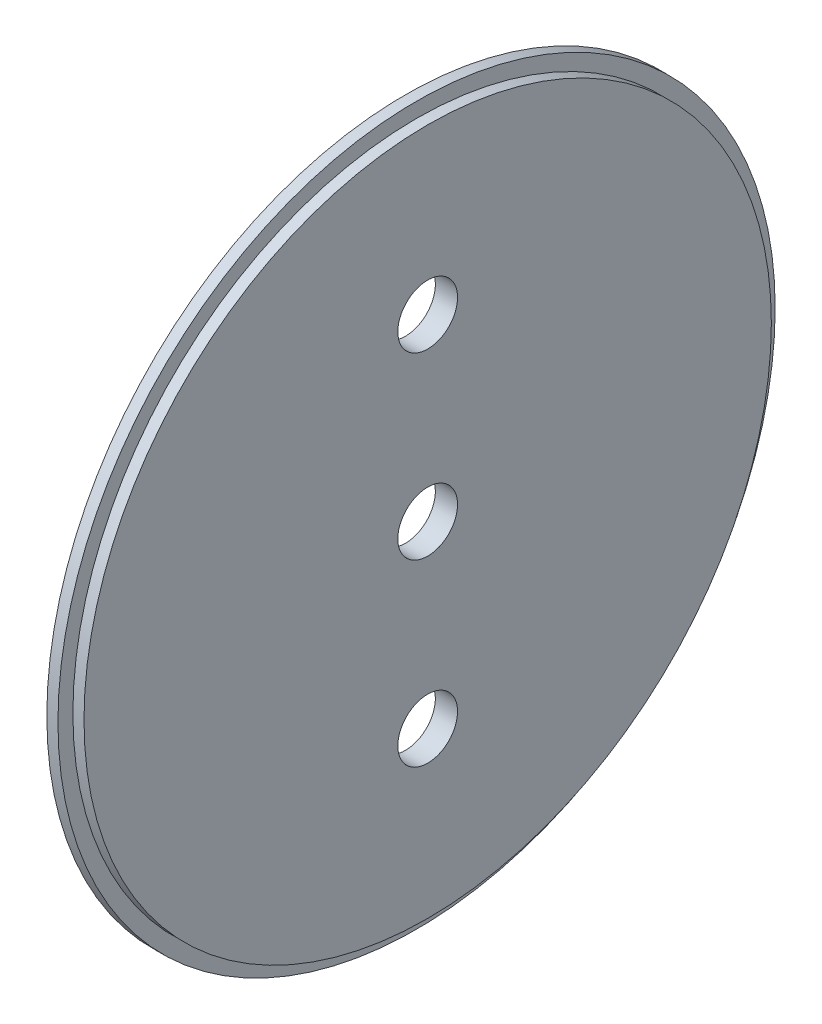
ISO-10303-21;
HEADER;
FILE_DESCRIPTION(('STEP AP214'),'2;1');
FILE_NAME('part.step','',(''),(''),'','','');
FILE_SCHEMA(('AUTOMOTIVE_DESIGN { 1 0 10303 214 1 1 1 1 }'));
ENDSEC;
DATA;
#1=APPLICATION_CONTEXT('core data for automotive mechanical design processes');
#2=APPLICATION_PROTOCOL_DEFINITION('international standard','automotive_design',2000,#1);
#3=PRODUCT_CONTEXT('',#1,'mechanical');
#4=PRODUCT('Part','Part','',(#3));
#5=PRODUCT_RELATED_PRODUCT_CATEGORY('part','',(#4));
#6=PRODUCT_DEFINITION_FORMATION('','',#4);
#7=PRODUCT_DEFINITION_CONTEXT('part definition',#1,'design');
#8=PRODUCT_DEFINITION('design','',#6,#7);
#9=PRODUCT_DEFINITION_SHAPE('','',#8);
#10=(LENGTH_UNIT() NAMED_UNIT(*) SI_UNIT(.MILLI.,.METRE.));
#11=(NAMED_UNIT(*) PLANE_ANGLE_UNIT() SI_UNIT($,.RADIAN.));
#12=(NAMED_UNIT(*) SI_UNIT($,.STERADIAN.) SOLID_ANGLE_UNIT());
#13=UNCERTAINTY_MEASURE_WITH_UNIT(LENGTH_MEASURE(1.E-05),#10,'distance_accuracy_value','');
#14=(GEOMETRIC_REPRESENTATION_CONTEXT(3) GLOBAL_UNCERTAINTY_ASSIGNED_CONTEXT((#13)) GLOBAL_UNIT_ASSIGNED_CONTEXT((#10,
#11,#12)) REPRESENTATION_CONTEXT('',''));
#15=CARTESIAN_POINT('',(0.,0.,0.));
#16=DIRECTION('',(0.,0.,1.));
#17=DIRECTION('',(1.,0.,0.));
#18=AXIS2_PLACEMENT_3D('',#15,#16,#17);
#19=CARTESIAN_POINT('',(1.1811,0.,0.));
#20=DIRECTION('',(-1.,0.,0.));
#21=DIRECTION('',(0.,0.,1.));
#22=AXIS2_PLACEMENT_3D('',#19,#20,#21);
#23=CYLINDRICAL_SURFACE('',#22,38.1);
#24=CARTESIAN_POINT('',(1.1811,0.,0.));
#25=DIRECTION('',(1.,0.,0.));
#26=DIRECTION('',(0.,0.,-1.));
#27=AXIS2_PLACEMENT_3D('',#24,#25,#26);
#28=CIRCLE('',#27,38.1);
#29=CARTESIAN_POINT('',(1.1811,0.,-38.1));
#30=VERTEX_POINT('',#29);
#31=EDGE_CURVE('E51',#30,#30,#28,.T.);
#32=ORIENTED_EDGE('',*,*,#31,.F.);
#33=EDGE_LOOP('',(#32));
#34=FACE_BOUND('',#33,.T.);
#35=CARTESIAN_POINT('',(0.,0.,0.));
#36=DIRECTION('',(1.,0.,0.));
#37=DIRECTION('',(0.,0.,-1.));
#38=AXIS2_PLACEMENT_3D('',#35,#36,#37);
#39=CIRCLE('',#38,38.1);
#40=CARTESIAN_POINT('',(0.,0.,-38.1));
#41=VERTEX_POINT('',#40);
#42=EDGE_CURVE('E46',#41,#41,#39,.T.);
#43=ORIENTED_EDGE('',*,*,#42,.T.);
#44=EDGE_LOOP('',(#43));
#45=FACE_BOUND('',#44,.T.);
#46=ADVANCED_FACE('F43',(#34,#45),#23,.T.);
#47=CARTESIAN_POINT('',(1.1811,0.,0.));
#48=DIRECTION('',(1.,0.,0.));
#49=DIRECTION('',(0.,0.,-1.));
#50=AXIS2_PLACEMENT_3D('',#47,#48,#49);
#51=PLANE('',#50);
#52=CARTESIAN_POINT('',(1.1811,0.,0.));
#53=DIRECTION('',(1.,0.,0.));
#54=DIRECTION('',(0.,0.,-1.));
#55=AXIS2_PLACEMENT_3D('',#52,#53,#54);
#56=CIRCLE('',#55,36.5125);
#57=CARTESIAN_POINT('',(1.1811,0.,-36.5125));
#58=VERTEX_POINT('',#57);
#59=EDGE_CURVE('E10',#58,#58,#56,.T.);
#60=ORIENTED_EDGE('',*,*,#59,.F.);
#61=EDGE_LOOP('',(#60));
#62=FACE_BOUND('',#61,.T.);
#63=ORIENTED_EDGE('',*,*,#31,.T.);
#64=EDGE_LOOP('',(#63));
#65=FACE_BOUND('',#64,.T.);
#66=ADVANCED_FACE('F93',(#62,#65),#51,.T.);
#67=CARTESIAN_POINT('',(0.,0.,0.));
#68=DIRECTION('',(1.,0.,0.));
#69=DIRECTION('',(0.,0.,-1.));
#70=AXIS2_PLACEMENT_3D('',#67,#68,#69);
#71=PLANE('',#70);
#72=CARTESIAN_POINT('',(0.,19.05,0.));
#73=DIRECTION('',(-1.,0.,0.));
#74=DIRECTION('',(0.,0.,1.));
#75=AXIS2_PLACEMENT_3D('',#72,#73,#74);
#76=CIRCLE('',#75,3.17500000000001);
#77=CARTESIAN_POINT('',(0.,19.05,3.17500000000001));
#78=VERTEX_POINT('',#77);
#79=EDGE_CURVE('E75',#78,#78,#76,.T.);
#80=ORIENTED_EDGE('',*,*,#79,.F.);
#81=EDGE_LOOP('',(#80));
#82=FACE_BOUND('',#81,.T.);
#83=CARTESIAN_POINT('',(0.,-19.05,0.));
#84=DIRECTION('',(-1.,0.,0.));
#85=DIRECTION('',(0.,0.,1.));
#86=AXIS2_PLACEMENT_3D('',#83,#84,#85);
#87=CIRCLE('',#86,3.175);
#88=CARTESIAN_POINT('',(0.,-19.05,3.175));
#89=VERTEX_POINT('',#88);
#90=EDGE_CURVE('E67',#89,#89,#87,.T.);
#91=ORIENTED_EDGE('',*,*,#90,.F.);
#92=EDGE_LOOP('',(#91));
#93=FACE_BOUND('',#92,.T.);
#94=CARTESIAN_POINT('',(0.,0.,0.));
#95=DIRECTION('',(-1.,0.,0.));
#96=DIRECTION('',(0.,0.,1.));
#97=AXIS2_PLACEMENT_3D('',#94,#95,#96);
#98=CIRCLE('',#97,3.175);
#99=CARTESIAN_POINT('',(0.,0.,3.175));
#100=VERTEX_POINT('',#99);
#101=EDGE_CURVE('E63',#100,#100,#98,.T.);
#102=ORIENTED_EDGE('',*,*,#101,.F.);
#103=EDGE_LOOP('',(#102));
#104=FACE_BOUND('',#103,.T.);
#105=ORIENTED_EDGE('',*,*,#42,.F.);
#106=EDGE_LOOP('',(#105));
#107=FACE_BOUND('',#106,.T.);
#108=ADVANCED_FACE('F89',(#82,#93,#104,#107),#71,.F.);
#109=CARTESIAN_POINT('',(2.3622,0.,0.));
#110=DIRECTION('',(-1.,0.,0.));
#111=DIRECTION('',(0.,0.,1.));
#112=AXIS2_PLACEMENT_3D('',#109,#110,#111);
#113=CYLINDRICAL_SURFACE('',#112,36.5125);
#114=CARTESIAN_POINT('',(2.3622,0.,0.));
#115=DIRECTION('',(1.,0.,0.));
#116=DIRECTION('',(0.,0.,-1.));
#117=AXIS2_PLACEMENT_3D('',#114,#115,#116);
#118=CIRCLE('',#117,36.5125);
#119=CARTESIAN_POINT('',(2.3622,0.,-36.5125));
#120=VERTEX_POINT('',#119);
#121=EDGE_CURVE('E58',#120,#120,#118,.T.);
#122=ORIENTED_EDGE('',*,*,#121,.F.);
#123=EDGE_LOOP('',(#122));
#124=FACE_BOUND('',#123,.T.);
#125=ORIENTED_EDGE('',*,*,#59,.T.);
#126=EDGE_LOOP('',(#125));
#127=FACE_BOUND('',#126,.T.);
#128=ADVANCED_FACE('F92',(#124,#127),#113,.T.);
#129=CARTESIAN_POINT('',(2.3622,0.,0.));
#130=DIRECTION('',(1.,0.,0.));
#131=DIRECTION('',(0.,0.,-1.));
#132=AXIS2_PLACEMENT_3D('',#129,#130,#131);
#133=PLANE('',#132);
#134=CARTESIAN_POINT('',(2.3622,19.05,0.));
#135=DIRECTION('',(-1.,0.,0.));
#136=DIRECTION('',(0.,0.,1.));
#137=AXIS2_PLACEMENT_3D('',#134,#135,#136);
#138=CIRCLE('',#137,3.17500000000001);
#139=CARTESIAN_POINT('',(2.3622,19.05,3.17500000000001));
#140=VERTEX_POINT('',#139);
#141=EDGE_CURVE('E71',#140,#140,#138,.T.);
#142=ORIENTED_EDGE('',*,*,#141,.T.);
#143=EDGE_LOOP('',(#142));
#144=FACE_BOUND('',#143,.T.);
#145=CARTESIAN_POINT('',(2.3622,-19.05,0.));
#146=DIRECTION('',(-1.,0.,0.));
#147=DIRECTION('',(0.,0.,1.));
#148=AXIS2_PLACEMENT_3D('',#145,#146,#147);
#149=CIRCLE('',#148,3.175);
#150=CARTESIAN_POINT('',(2.3622,-19.05,3.175));
#151=VERTEX_POINT('',#150);
#152=EDGE_CURVE('E79',#151,#151,#149,.T.);
#153=ORIENTED_EDGE('',*,*,#152,.T.);
#154=EDGE_LOOP('',(#153));
#155=FACE_BOUND('',#154,.T.);
#156=CARTESIAN_POINT('',(2.3622,0.,0.));
#157=DIRECTION('',(-1.,0.,0.));
#158=DIRECTION('',(0.,0.,1.));
#159=AXIS2_PLACEMENT_3D('',#156,#157,#158);
#160=CIRCLE('',#159,3.175);
#161=CARTESIAN_POINT('',(2.3622,0.,3.175));
#162=VERTEX_POINT('',#161);
#163=EDGE_CURVE('E62',#162,#162,#160,.T.);
#164=ORIENTED_EDGE('',*,*,#163,.T.);
#165=EDGE_LOOP('',(#164));
#166=FACE_BOUND('',#165,.T.);
#167=ORIENTED_EDGE('',*,*,#121,.T.);
#168=EDGE_LOOP('',(#167));
#169=FACE_BOUND('',#168,.T.);
#170=ADVANCED_FACE('F115',(#144,#155,#166,#169),#133,.T.);
#171=CARTESIAN_POINT('',(2.3622,0.,0.));
#172=DIRECTION('',(-1.,0.,0.));
#173=DIRECTION('',(0.,0.,1.));
#174=AXIS2_PLACEMENT_3D('',#171,#172,#173);
#175=CYLINDRICAL_SURFACE('',#174,3.175);
#176=ORIENTED_EDGE('',*,*,#163,.F.);
#177=EDGE_LOOP('',(#176));
#178=FACE_BOUND('',#177,.T.);
#179=ORIENTED_EDGE('',*,*,#101,.T.);
#180=EDGE_LOOP('',(#179));
#181=FACE_BOUND('',#180,.T.);
#182=ADVANCED_FACE('F119',(#178,#181),#175,.F.);
#183=CARTESIAN_POINT('',(2.3622,-19.05,0.));
#184=DIRECTION('',(-1.,0.,0.));
#185=DIRECTION('',(0.,0.,1.));
#186=AXIS2_PLACEMENT_3D('',#183,#184,#185);
#187=CYLINDRICAL_SURFACE('',#186,3.175);
#188=ORIENTED_EDGE('',*,*,#152,.F.);
#189=EDGE_LOOP('',(#188));
#190=FACE_BOUND('',#189,.T.);
#191=ORIENTED_EDGE('',*,*,#90,.T.);
#192=EDGE_LOOP('',(#191));
#193=FACE_BOUND('',#192,.T.);
#194=ADVANCED_FACE('F87',(#190,#193),#187,.F.);
#195=CARTESIAN_POINT('',(2.3622,19.05,0.));
#196=DIRECTION('',(-1.,0.,0.));
#197=DIRECTION('',(0.,0.,1.));
#198=AXIS2_PLACEMENT_3D('',#195,#196,#197);
#199=CYLINDRICAL_SURFACE('',#198,3.17500000000001);
#200=ORIENTED_EDGE('',*,*,#141,.F.);
#201=EDGE_LOOP('',(#200));
#202=FACE_BOUND('',#201,.T.);
#203=ORIENTED_EDGE('',*,*,#79,.T.);
#204=EDGE_LOOP('',(#203));
#205=FACE_BOUND('',#204,.T.);
#206=ADVANCED_FACE('F124',(#202,#205),#199,.F.);
#207=CLOSED_SHELL('',(#46,#66,#108,#128,#170,#182,#194,#206));
#208=MANIFOLD_SOLID_BREP('B2',#207);
#209=ADVANCED_BREP_SHAPE_REPRESENTATION('',(#18,#208),#14);
#210=SHAPE_DEFINITION_REPRESENTATION(#9,#209);
ENDSEC;
END-ISO-10303-21;
